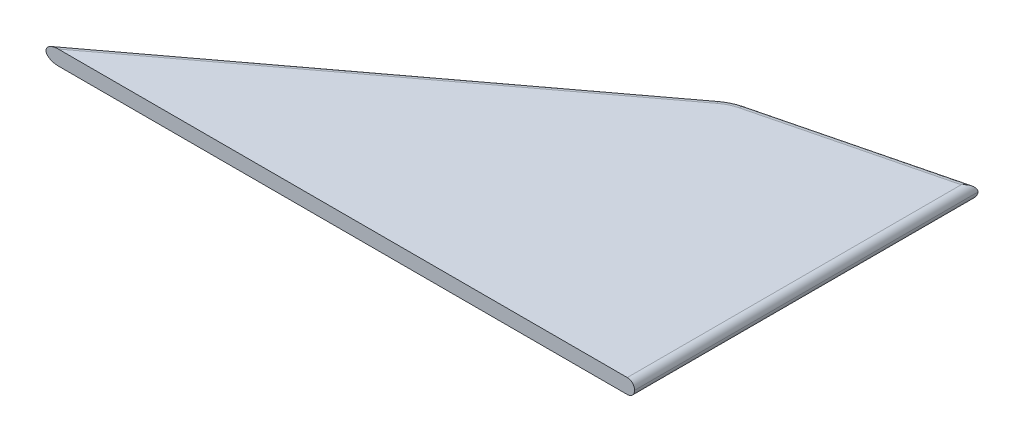
ISO-10303-21;
HEADER;
FILE_DESCRIPTION(('STEP AP214'),'2;1');
FILE_NAME('part.step','',(''),(''),'','','');
FILE_SCHEMA(('AUTOMOTIVE_DESIGN { 1 0 10303 214 1 1 1 1 }'));
ENDSEC;
DATA;
#1=APPLICATION_CONTEXT('core data for automotive mechanical design processes');
#2=APPLICATION_PROTOCOL_DEFINITION('international standard','automotive_design',2000,#1);
#3=PRODUCT_CONTEXT('',#1,'mechanical');
#4=PRODUCT('Part','Part','',(#3));
#5=PRODUCT_RELATED_PRODUCT_CATEGORY('part','',(#4));
#6=PRODUCT_DEFINITION_FORMATION('','',#4);
#7=PRODUCT_DEFINITION_CONTEXT('part definition',#1,'design');
#8=PRODUCT_DEFINITION('design','',#6,#7);
#9=PRODUCT_DEFINITION_SHAPE('','',#8);
#10=(LENGTH_UNIT() NAMED_UNIT(*) SI_UNIT(.MILLI.,.METRE.));
#11=(NAMED_UNIT(*) PLANE_ANGLE_UNIT() SI_UNIT($,.RADIAN.));
#12=(NAMED_UNIT(*) SI_UNIT($,.STERADIAN.) SOLID_ANGLE_UNIT());
#13=UNCERTAINTY_MEASURE_WITH_UNIT(LENGTH_MEASURE(1.E-05),#10,'distance_accuracy_value','');
#14=(GEOMETRIC_REPRESENTATION_CONTEXT(3) GLOBAL_UNCERTAINTY_ASSIGNED_CONTEXT((#13)) GLOBAL_UNIT_ASSIGNED_CONTEXT((#10,
#11,#12)) REPRESENTATION_CONTEXT('',''));
#15=CARTESIAN_POINT('',(0.,0.,0.));
#16=DIRECTION('',(0.,0.,1.));
#17=DIRECTION('',(1.,0.,0.));
#18=AXIS2_PLACEMENT_3D('',#15,#16,#17);
#19=CARTESIAN_POINT('',(0.,3.,0.));
#20=DIRECTION('',(0.,0.,-1.));
#21=DIRECTION('',(-1.,0.,0.));
#22=AXIS2_PLACEMENT_3D('',#19,#20,#21);
#23=PLANE('',#22);
#24=CARTESIAN_POINT('',(118.5,1.5,0.));
#25=DIRECTION('',(0.,0.,-1.));
#26=DIRECTION('',(-1.,0.,0.));
#27=AXIS2_PLACEMENT_3D('',#24,#25,#26);
#28=CIRCLE('',#27,1.5);
#29=CARTESIAN_POINT('',(118.5,0.,0.));
#30=VERTEX_POINT('',#29);
#31=CARTESIAN_POINT('',(120.,1.5,0.));
#32=VERTEX_POINT('',#31);
#33=EDGE_CURVE('E45',#30,#32,#28,.F.);
#34=ORIENTED_EDGE('',*,*,#33,.T.);
#35=CARTESIAN_POINT('',(118.5,1.5,0.));
#36=DIRECTION('',(0.,0.,-1.));
#37=DIRECTION('',(-1.,0.,0.));
#38=AXIS2_PLACEMENT_3D('',#35,#36,#37);
#39=CIRCLE('',#38,1.5);
#40=CARTESIAN_POINT('',(118.5,3.,0.));
#41=VERTEX_POINT('',#40);
#42=EDGE_CURVE('E11',#32,#41,#39,.F.);
#43=ORIENTED_EDGE('',*,*,#42,.T.);
#44=DIRECTION('',(1.,0.,0.));
#45=VECTOR('',#44,1.);
#46=CARTESIAN_POINT('',(0.,3.,0.));
#47=LINE('',#46,#45);
#48=CARTESIAN_POINT('',(2.5,3.,0.));
#49=VERTEX_POINT('',#48);
#50=EDGE_CURVE('E123',#49,#41,#47,.T.);
#51=ORIENTED_EDGE('',*,*,#50,.F.);
#52=CARTESIAN_POINT('',(2.5,1.5,0.));
#53=DIRECTION('',(0.,0.,-1.));
#54=DIRECTION('',(-1.,0.,0.));
#55=AXIS2_PLACEMENT_3D('',#52,#53,#54);
#56=ELLIPSE('',#55,2.5,1.5);
#57=CARTESIAN_POINT('',(0.,1.5,0.));
#58=VERTEX_POINT('',#57);
#59=EDGE_CURVE('E54',#49,#58,#56,.F.);
#60=ORIENTED_EDGE('',*,*,#59,.T.);
#61=CARTESIAN_POINT('',(2.49999999999999,1.5,0.));
#62=DIRECTION('',(0.,0.,-1.));
#63=DIRECTION('',(1.,0.,0.));
#64=AXIS2_PLACEMENT_3D('',#61,#62,#63);
#65=ELLIPSE('',#64,2.5,1.5);
#66=CARTESIAN_POINT('',(2.49999999999999,0.,0.));
#67=VERTEX_POINT('',#66);
#68=EDGE_CURVE('E150',#58,#67,#65,.F.);
#69=ORIENTED_EDGE('',*,*,#68,.T.);
#70=DIRECTION('',(1.,0.,0.));
#71=VECTOR('',#70,1.);
#72=CARTESIAN_POINT('',(0.,0.,0.));
#73=LINE('',#72,#71);
#74=EDGE_CURVE('E118',#67,#30,#73,.T.);
#75=ORIENTED_EDGE('',*,*,#74,.T.);
#76=EDGE_LOOP('',(#34,#43,#51,#60,#69,#75));
#77=FACE_BOUND('',#76,.T.);
#78=ADVANCED_FACE('F35',(#77),#23,.F.);
#79=CARTESIAN_POINT('',(0.,3.,0.));
#80=DIRECTION('',(0.,-1.,0.));
#81=DIRECTION('',(0.,0.,-1.));
#82=AXIS2_PLACEMENT_3D('',#79,#80,#81);
#83=PLANE('',#82);
#84=ORIENTED_EDGE('',*,*,#50,.T.);
#85=DIRECTION('',(0.,0.,-1.));
#86=VECTOR('',#85,1.);
#87=CARTESIAN_POINT('',(118.5,3.,0.));
#88=LINE('',#87,#86);
#89=CARTESIAN_POINT('',(118.5,3.,-68.0788353903934));
#90=VERTEX_POINT('',#89);
#91=EDGE_CURVE('E146',#41,#90,#88,.T.);
#92=ORIENTED_EDGE('',*,*,#91,.T.);
#93=DIRECTION('',(-0.970142500145332,0.,0.242535625036333));
#94=VECTOR('',#93,1.);
#95=CARTESIAN_POINT('',(-9.04796126832786,3.,-36.1918450733114));
#96=LINE('',#95,#94);
#97=CARTESIAN_POINT('',(82.3229190591029,3.,-59.0345651551691));
#98=VERTEX_POINT('',#97);
#99=EDGE_CURVE('E143',#90,#98,#96,.T.);
#100=ORIENTED_EDGE('',*,*,#99,.T.);
#101=CARTESIAN_POINT('',(84.3844718719117,3.,-50.7883539039338));
#102=DIRECTION('',(0.,-1.,0.));
#103=DIRECTION('',(0.,0.,-1.));
#104=AXIS2_PLACEMENT_3D('',#101,#102,#103);
#105=CIRCLE('',#104,8.5);
#106=CARTESIAN_POINT('',(79.2844718719117,3.,-57.5883539039338));
#107=VERTEX_POINT('',#106);
#108=EDGE_CURVE('E78',#98,#107,#105,.F.);
#109=ORIENTED_EDGE('',*,*,#108,.T.);
#110=DIRECTION('',(-0.8,0.,0.6));
#111=VECTOR('',#110,1.);
#112=CARTESIAN_POINT('',(0.900000000000001,3.,1.2));
#113=LINE('',#112,#111);
#114=EDGE_CURVE('E139',#107,#49,#113,.T.);
#115=ORIENTED_EDGE('',*,*,#114,.T.);
#116=EDGE_LOOP('',(#84,#92,#100,#109,#115));
#117=FACE_BOUND('',#116,.T.);
#118=ADVANCED_FACE('F160',(#117),#83,.F.);
#119=CARTESIAN_POINT('',(0.,0.,0.));
#120=DIRECTION('',(0.,-1.,0.));
#121=DIRECTION('',(0.,0.,-1.));
#122=AXIS2_PLACEMENT_3D('',#119,#120,#121);
#123=PLANE('',#122);
#124=DIRECTION('',(-0.970142500145332,0.,0.242535625036333));
#125=VECTOR('',#124,1.);
#126=CARTESIAN_POINT('',(120.363803437554,0.,-68.544786249782));
#127=LINE('',#126,#125);
#128=CARTESIAN_POINT('',(82.3229190591029,0.,-59.0345651551691));
#129=VERTEX_POINT('',#128);
#130=CARTESIAN_POINT('',(118.5,0.,-68.0788353903934));
#131=VERTEX_POINT('',#130);
#132=EDGE_CURVE('E107',#129,#131,#127,.F.);
#133=ORIENTED_EDGE('',*,*,#132,.T.);
#134=DIRECTION('',(0.,0.,-1.));
#135=VECTOR('',#134,1.);
#136=CARTESIAN_POINT('',(118.5,0.,0.));
#137=LINE('',#136,#135);
#138=EDGE_CURVE('E136',#131,#30,#137,.F.);
#139=ORIENTED_EDGE('',*,*,#138,.T.);
#140=ORIENTED_EDGE('',*,*,#74,.F.);
#141=DIRECTION('',(-0.8,0.,0.6));
#142=VECTOR('',#141,1.);
#143=CARTESIAN_POINT('',(79.2844718719117,0.,-57.5883539039338));
#144=LINE('',#143,#142);
#145=CARTESIAN_POINT('',(79.2844718719117,0.,-57.5883539039338));
#146=VERTEX_POINT('',#145);
#147=EDGE_CURVE('E128',#67,#146,#144,.F.);
#148=ORIENTED_EDGE('',*,*,#147,.T.);
#149=CARTESIAN_POINT('',(84.3844718719117,0.,-50.7883539039338));
#150=DIRECTION('',(0.,-1.,0.));
#151=DIRECTION('',(0.,0.,-1.));
#152=AXIS2_PLACEMENT_3D('',#149,#150,#151);
#153=CIRCLE('',#152,8.5);
#154=EDGE_CURVE('E133',#146,#129,#153,.T.);
#155=ORIENTED_EDGE('',*,*,#154,.T.);
#156=EDGE_LOOP('',(#133,#139,#140,#148,#155));
#157=FACE_BOUND('',#156,.T.);
#158=ADVANCED_FACE('F176',(#157),#123,.T.);
#159=CARTESIAN_POINT('',(118.5,1.5,0.));
#160=DIRECTION('',(0.,0.,-1.));
#161=DIRECTION('',(-1.,0.,0.));
#162=AXIS2_PLACEMENT_3D('',#159,#160,#161);
#163=CYLINDRICAL_SURFACE('',#162,1.5);
#164=ORIENTED_EDGE('',*,*,#91,.F.);
#165=ORIENTED_EDGE('',*,*,#42,.F.);
#166=DIRECTION('',(0.,0.,-1.));
#167=VECTOR('',#166,1.);
#168=CARTESIAN_POINT('',(120.,1.5,0.));
#169=LINE('',#168,#167);
#170=CARTESIAN_POINT('',(120.,1.5,-70.));
#171=VERTEX_POINT('',#170);
#172=EDGE_CURVE('E39',#171,#32,#169,.F.);
#173=ORIENTED_EDGE('',*,*,#172,.F.);
#174=CARTESIAN_POINT('',(118.5,1.5,-68.0788353903934));
#175=DIRECTION('',(-0.788205438016109,0.,-0.615412209402636));
#176=DIRECTION('',(-0.615412209402636,0.,0.788205438016109));
#177=AXIS2_PLACEMENT_3D('',#174,#175,#176);
#178=ELLIPSE('',#177,2.43739070671999,1.5);
#179=EDGE_CURVE('E81',#90,#171,#178,.T.);
#180=ORIENTED_EDGE('',*,*,#179,.F.);
#181=EDGE_LOOP('',(#164,#165,#173,#180));
#182=FACE_BOUND('',#181,.T.);
#183=ADVANCED_FACE('F37',(#182),#163,.T.);
#184=CARTESIAN_POINT('',(0.900000000000001,1.5,1.2));
#185=DIRECTION('',(-0.8,0.,0.6));
#186=DIRECTION('',(0.6,0.,0.8));
#187=AXIS2_PLACEMENT_3D('',#184,#185,#186);
#188=CYLINDRICAL_SURFACE('',#187,1.5);
#189=ORIENTED_EDGE('',*,*,#59,.F.);
#190=ORIENTED_EDGE('',*,*,#114,.F.);
#191=CARTESIAN_POINT('',(79.2844718719117,1.5,-57.5883539039338));
#192=DIRECTION('',(0.8,0.,-0.599999999999999));
#193=DIRECTION('',(-0.599999999999999,0.,-0.800000000000001));
#194=AXIS2_PLACEMENT_3D('',#191,#192,#193);
#195=CIRCLE('',#194,1.5);
#196=CARTESIAN_POINT('',(78.3844718719117,1.5,-58.7883539039338));
#197=VERTEX_POINT('',#196);
#198=EDGE_CURVE('E82',#197,#107,#195,.T.);
#199=ORIENTED_EDGE('',*,*,#198,.F.);
#200=DIRECTION('',(-0.8,0.,0.6));
#201=VECTOR('',#200,1.);
#202=CARTESIAN_POINT('',(80.,1.5,-60.));
#203=LINE('',#202,#201);
#204=EDGE_CURVE('E114',#58,#197,#203,.F.);
#205=ORIENTED_EDGE('',*,*,#204,.F.);
#206=EDGE_LOOP('',(#189,#190,#199,#205));
#207=FACE_BOUND('',#206,.T.);
#208=ADVANCED_FACE('F180',(#207),#188,.T.);
#209=CARTESIAN_POINT('',(118.5,1.5,0.));
#210=DIRECTION('',(0.,0.,1.));
#211=DIRECTION('',(1.,0.,0.));
#212=AXIS2_PLACEMENT_3D('',#209,#210,#211);
#213=CYLINDRICAL_SURFACE('',#212,1.5);
#214=ORIENTED_EDGE('',*,*,#33,.F.);
#215=ORIENTED_EDGE('',*,*,#138,.F.);
#216=CARTESIAN_POINT('',(118.5,1.5,-68.0788353903934));
#217=DIRECTION('',(0.788205438016109,0.,0.615412209402636));
#218=DIRECTION('',(0.615412209402636,0.,-0.788205438016109));
#219=AXIS2_PLACEMENT_3D('',#216,#217,#218);
#220=ELLIPSE('',#219,2.43739070671999,1.5);
#221=EDGE_CURVE('E93',#171,#131,#220,.F.);
#222=ORIENTED_EDGE('',*,*,#221,.F.);
#223=ORIENTED_EDGE('',*,*,#172,.T.);
#224=EDGE_LOOP('',(#214,#215,#222,#223));
#225=FACE_BOUND('',#224,.T.);
#226=ADVANCED_FACE('F178',(#225),#213,.T.);
#227=CARTESIAN_POINT('',(-9.04796126832786,1.5,-36.1918450733114));
#228=DIRECTION('',(-0.970142500145332,0.,0.242535625036333));
#229=DIRECTION('',(0.242535625036333,0.,0.970142500145332));
#230=AXIS2_PLACEMENT_3D('',#227,#228,#229);
#231=CYLINDRICAL_SURFACE('',#230,1.5);
#232=CARTESIAN_POINT('',(82.3229190591029,1.5,-59.0345651551691));
#233=DIRECTION('',(-0.970142500145332,0.,0.242535625036334));
#234=DIRECTION('',(0.242535625036334,0.,0.970142500145332));
#235=AXIS2_PLACEMENT_3D('',#232,#233,#234);
#236=CIRCLE('',#235,1.5);
#237=CARTESIAN_POINT('',(81.9591156215484,1.5,-60.4897789053871));
#238=VERTEX_POINT('',#237);
#239=EDGE_CURVE('E69',#98,#238,#236,.T.);
#240=ORIENTED_EDGE('',*,*,#239,.F.);
#241=ORIENTED_EDGE('',*,*,#99,.F.);
#242=ORIENTED_EDGE('',*,*,#179,.T.);
#243=DIRECTION('',(-0.970142500145332,0.,0.242535625036333));
#244=VECTOR('',#243,1.);
#245=CARTESIAN_POINT('',(120.,1.5,-70.));
#246=LINE('',#245,#244);
#247=EDGE_CURVE('E86',#238,#171,#246,.F.);
#248=ORIENTED_EDGE('',*,*,#247,.F.);
#249=EDGE_LOOP('',(#240,#241,#242,#248));
#250=FACE_BOUND('',#249,.T.);
#251=ADVANCED_FACE('F87',(#250),#231,.T.);
#252=CARTESIAN_POINT('',(84.3844718719117,1.5,-50.7883539039338));
#253=DIRECTION('',(0.,-1.,0.));
#254=DIRECTION('',(0.,0.,-1.));
#255=AXIS2_PLACEMENT_3D('',#252,#253,#254);
#256=TOROIDAL_SURFACE('',#255,8.5,1.5);
#257=ORIENTED_EDGE('',*,*,#108,.F.);
#258=ORIENTED_EDGE('',*,*,#239,.T.);
#259=CARTESIAN_POINT('',(84.3844718719117,1.5,-50.7883539039338));
#260=DIRECTION('',(0.,-1.,0.));
#261=DIRECTION('',(0.,0.,-1.));
#262=AXIS2_PLACEMENT_3D('',#259,#260,#261);
#263=CIRCLE('',#262,10.);
#264=EDGE_CURVE('E74',#197,#238,#263,.T.);
#265=ORIENTED_EDGE('',*,*,#264,.F.);
#266=ORIENTED_EDGE('',*,*,#198,.T.);
#267=EDGE_LOOP('',(#257,#258,#265,#266));
#268=FACE_BOUND('',#267,.T.);
#269=ADVANCED_FACE('F71',(#268),#256,.T.);
#270=CARTESIAN_POINT('',(80.9,1.5,-58.8));
#271=DIRECTION('',(0.8,0.,-0.6));
#272=DIRECTION('',(-0.6,0.,-0.8));
#273=AXIS2_PLACEMENT_3D('',#270,#271,#272);
#274=CYLINDRICAL_SURFACE('',#273,1.5);
#275=ORIENTED_EDGE('',*,*,#68,.F.);
#276=ORIENTED_EDGE('',*,*,#204,.T.);
#277=CARTESIAN_POINT('',(79.2844718719117,1.5,-57.5883539039338));
#278=DIRECTION('',(0.8,0.,-0.599999999999999));
#279=DIRECTION('',(-0.599999999999999,0.,-0.800000000000001));
#280=AXIS2_PLACEMENT_3D('',#277,#278,#279);
#281=CIRCLE('',#280,1.5);
#282=EDGE_CURVE('E103',#146,#197,#281,.T.);
#283=ORIENTED_EDGE('',*,*,#282,.F.);
#284=ORIENTED_EDGE('',*,*,#147,.F.);
#285=EDGE_LOOP('',(#275,#276,#283,#284));
#286=FACE_BOUND('',#285,.T.);
#287=ADVANCED_FACE('F177',(#286),#274,.T.);
#288=CARTESIAN_POINT('',(120.363803437554,1.5,-68.544786249782));
#289=DIRECTION('',(0.970142500145332,0.,-0.242535625036333));
#290=DIRECTION('',(-0.242535625036333,0.,-0.970142500145332));
#291=AXIS2_PLACEMENT_3D('',#288,#289,#290);
#292=CYLINDRICAL_SURFACE('',#291,1.5);
#293=ORIENTED_EDGE('',*,*,#221,.T.);
#294=ORIENTED_EDGE('',*,*,#132,.F.);
#295=CARTESIAN_POINT('',(82.3229190591029,1.5,-59.0345651551691));
#296=DIRECTION('',(-0.970142500145331,0.,0.242535625036335));
#297=DIRECTION('',(0.242535625036335,0.,0.970142500145332));
#298=AXIS2_PLACEMENT_3D('',#295,#296,#297);
#299=CIRCLE('',#298,1.5);
#300=EDGE_CURVE('E100',#238,#129,#299,.T.);
#301=ORIENTED_EDGE('',*,*,#300,.F.);
#302=ORIENTED_EDGE('',*,*,#247,.T.);
#303=EDGE_LOOP('',(#293,#294,#301,#302));
#304=FACE_BOUND('',#303,.T.);
#305=ADVANCED_FACE('F105',(#304),#292,.T.);
#306=CARTESIAN_POINT('',(84.3844718719117,1.5,-50.7883539039338));
#307=DIRECTION('',(0.,-1.,0.));
#308=DIRECTION('',(0.,0.,-1.));
#309=AXIS2_PLACEMENT_3D('',#306,#307,#308);
#310=TOROIDAL_SURFACE('',#309,8.5,1.5);
#311=ORIENTED_EDGE('',*,*,#282,.T.);
#312=ORIENTED_EDGE('',*,*,#264,.T.);
#313=ORIENTED_EDGE('',*,*,#300,.T.);
#314=ORIENTED_EDGE('',*,*,#154,.F.);
#315=EDGE_LOOP('',(#311,#312,#313,#314));
#316=FACE_BOUND('',#315,.T.);
#317=ADVANCED_FACE('F97',(#316),#310,.T.);
#318=CLOSED_SHELL('',(#78,#118,#158,#183,#208,#226,#251,#269,#287,#305,#317));
#319=MANIFOLD_SOLID_BREP('B2',#318);
#320=ADVANCED_BREP_SHAPE_REPRESENTATION('',(#18,#319),#14);
#321=SHAPE_DEFINITION_REPRESENTATION(#9,#320);
ENDSEC;
END-ISO-10303-21;
